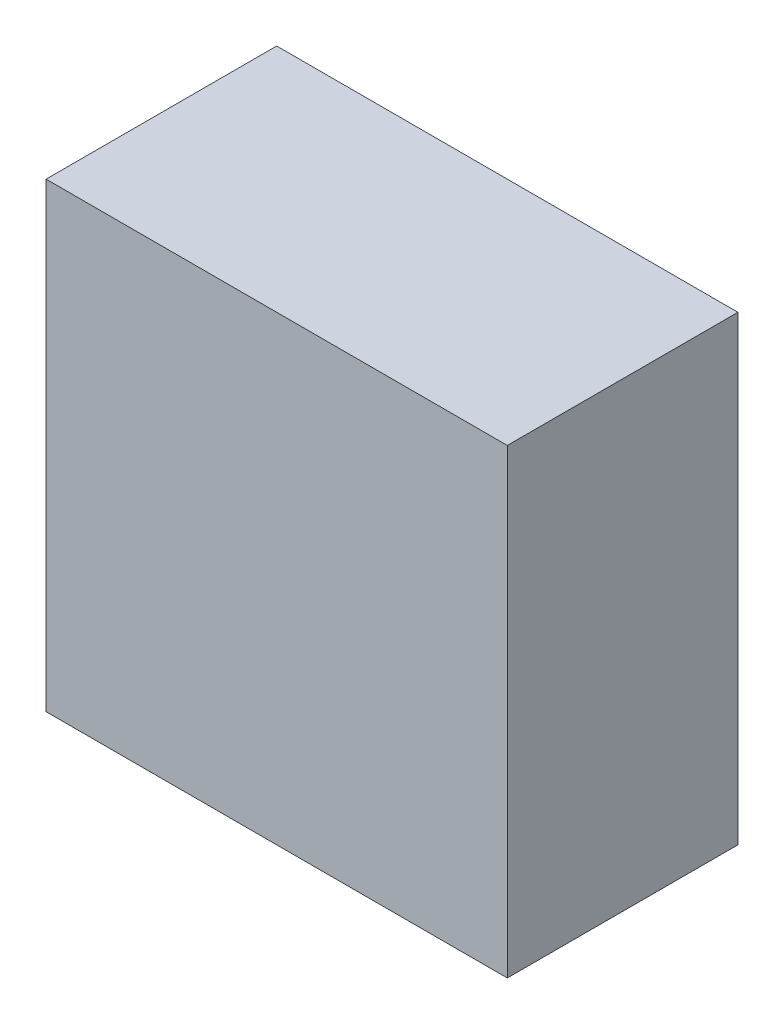
ISO-10303-21;
HEADER;
FILE_DESCRIPTION(('STEP AP214'),'2;1');
FILE_NAME('part.step','',(''),(''),'','','');
FILE_SCHEMA(('AUTOMOTIVE_DESIGN { 1 0 10303 214 1 1 1 1 }'));
ENDSEC;
DATA;
#1=APPLICATION_CONTEXT('core data for automotive mechanical design processes');
#2=APPLICATION_PROTOCOL_DEFINITION('international standard','automotive_design',2000,#1);
#3=PRODUCT_CONTEXT('',#1,'mechanical');
#4=PRODUCT('Part','Part','',(#3));
#5=PRODUCT_RELATED_PRODUCT_CATEGORY('part','',(#4));
#6=PRODUCT_DEFINITION_FORMATION('','',#4);
#7=PRODUCT_DEFINITION_CONTEXT('part definition',#1,'design');
#8=PRODUCT_DEFINITION('design','',#6,#7);
#9=PRODUCT_DEFINITION_SHAPE('','',#8);
#10=(LENGTH_UNIT() NAMED_UNIT(*) SI_UNIT(.MILLI.,.METRE.));
#11=(NAMED_UNIT(*) PLANE_ANGLE_UNIT() SI_UNIT($,.RADIAN.));
#12=(NAMED_UNIT(*) SI_UNIT($,.STERADIAN.) SOLID_ANGLE_UNIT());
#13=UNCERTAINTY_MEASURE_WITH_UNIT(LENGTH_MEASURE(1.E-05),#10,'distance_accuracy_value','');
#14=(GEOMETRIC_REPRESENTATION_CONTEXT(3) GLOBAL_UNCERTAINTY_ASSIGNED_CONTEXT((#13)) GLOBAL_UNIT_ASSIGNED_CONTEXT((#10,
#11,#12)) REPRESENTATION_CONTEXT('',''));
#15=CARTESIAN_POINT('',(0.,0.,0.));
#16=DIRECTION('',(0.,0.,1.));
#17=DIRECTION('',(1.,0.,0.));
#18=AXIS2_PLACEMENT_3D('',#15,#16,#17);
#19=CARTESIAN_POINT('',(0.,0.,-10.));
#20=DIRECTION('',(-1.,0.,0.));
#21=DIRECTION('',(0.,0.,1.));
#22=AXIS2_PLACEMENT_3D('',#19,#20,#21);
#23=PLANE('',#22);
#24=DIRECTION('',(0.,0.,-1.));
#25=VECTOR('',#24,1.);
#26=CARTESIAN_POINT('',(0.,10.,5.));
#27=LINE('',#26,#25);
#28=CARTESIAN_POINT('',(0.,10.,5.));
#29=VERTEX_POINT('',#28);
#30=CARTESIAN_POINT('',(0.,10.,0.));
#31=VERTEX_POINT('',#30);
#32=EDGE_CURVE('E115',#29,#31,#27,.T.);
#33=ORIENTED_EDGE('',*,*,#32,.F.);
#34=DIRECTION('',(0.,-1.,0.));
#35=VECTOR('',#34,1.);
#36=CARTESIAN_POINT('',(0.,0.,5.));
#37=LINE('',#36,#35);
#38=CARTESIAN_POINT('',(0.,0.,5.));
#39=VERTEX_POINT('',#38);
#40=EDGE_CURVE('E105',#29,#39,#37,.T.);
#41=ORIENTED_EDGE('',*,*,#40,.T.);
#42=DIRECTION('',(0.,0.,1.));
#43=VECTOR('',#42,1.);
#44=CARTESIAN_POINT('',(0.,0.,-10.));
#45=LINE('',#44,#43);
#46=CARTESIAN_POINT('',(0.,0.,10.));
#47=VERTEX_POINT('',#46);
#48=EDGE_CURVE('E112',#39,#47,#45,.T.);
#49=ORIENTED_EDGE('',*,*,#48,.T.);
#50=DIRECTION('',(0.,-1.,0.));
#51=VECTOR('',#50,1.);
#52=CARTESIAN_POINT('',(0.,0.,10.));
#53=LINE('',#52,#51);
#54=CARTESIAN_POINT('',(0.,40.,10.));
#55=VERTEX_POINT('',#54);
#56=EDGE_CURVE('E146',#55,#47,#53,.T.);
#57=ORIENTED_EDGE('',*,*,#56,.F.);
#58=DIRECTION('',(0.,0.,1.));
#59=VECTOR('',#58,1.);
#60=CARTESIAN_POINT('',(0.,40.,-10.));
#61=LINE('',#60,#59);
#62=CARTESIAN_POINT('',(0.,40.,-10.));
#63=VERTEX_POINT('',#62);
#64=EDGE_CURVE('E11',#63,#55,#61,.T.);
#65=ORIENTED_EDGE('',*,*,#64,.F.);
#66=DIRECTION('',(0.,-1.,0.));
#67=VECTOR('',#66,1.);
#68=CARTESIAN_POINT('',(0.,0.,-10.));
#69=LINE('',#68,#67);
#70=CARTESIAN_POINT('',(0.,0.,-10.));
#71=VERTEX_POINT('',#70);
#72=EDGE_CURVE('E151',#63,#71,#69,.T.);
#73=ORIENTED_EDGE('',*,*,#72,.T.);
#74=CARTESIAN_POINT('',(0.,0.,0.));
#75=VERTEX_POINT('',#74);
#76=EDGE_CURVE('E38',#71,#75,#45,.T.);
#77=ORIENTED_EDGE('',*,*,#76,.T.);
#78=DIRECTION('',(0.,-1.,0.));
#79=VECTOR('',#78,1.);
#80=CARTESIAN_POINT('',(0.,0.,0.));
#81=LINE('',#80,#79);
#82=EDGE_CURVE('E51',#31,#75,#81,.T.);
#83=ORIENTED_EDGE('',*,*,#82,.F.);
#84=EDGE_LOOP('',(#33,#41,#49,#57,#65,#73,#77,#83));
#85=FACE_BOUND('',#84,.T.);
#86=ADVANCED_FACE('F35',(#85),#23,.T.);
#87=CARTESIAN_POINT('',(0.,0.,-10.));
#88=DIRECTION('',(0.,-1.,0.));
#89=DIRECTION('',(0.,0.,-1.));
#90=AXIS2_PLACEMENT_3D('',#87,#88,#89);
#91=PLANE('',#90);
#92=ORIENTED_EDGE('',*,*,#48,.F.);
#93=DIRECTION('',(1.,0.,0.));
#94=VECTOR('',#93,1.);
#95=CARTESIAN_POINT('',(0.,0.,5.));
#96=LINE('',#95,#94);
#97=CARTESIAN_POINT('',(10.,0.,5.));
#98=VERTEX_POINT('',#97);
#99=EDGE_CURVE('E101',#39,#98,#96,.T.);
#100=ORIENTED_EDGE('',*,*,#99,.T.);
#101=DIRECTION('',(0.,0.,-1.));
#102=VECTOR('',#101,1.);
#103=CARTESIAN_POINT('',(10.,0.,5.));
#104=LINE('',#103,#102);
#105=CARTESIAN_POINT('',(10.,0.,0.));
#106=VERTEX_POINT('',#105);
#107=EDGE_CURVE('E177',#98,#106,#104,.T.);
#108=ORIENTED_EDGE('',*,*,#107,.T.);
#109=DIRECTION('',(1.,0.,0.));
#110=VECTOR('',#109,1.);
#111=CARTESIAN_POINT('',(0.,0.,0.));
#112=LINE('',#111,#110);
#113=EDGE_CURVE('E188',#75,#106,#112,.T.);
#114=ORIENTED_EDGE('',*,*,#113,.F.);
#115=ORIENTED_EDGE('',*,*,#76,.F.);
#116=DIRECTION('',(1.,0.,0.));
#117=VECTOR('',#116,1.);
#118=CARTESIAN_POINT('',(0.,0.,-10.));
#119=LINE('',#118,#117);
#120=CARTESIAN_POINT('',(40.,0.,-10.));
#121=VERTEX_POINT('',#120);
#122=EDGE_CURVE('E131',#71,#121,#119,.T.);
#123=ORIENTED_EDGE('',*,*,#122,.T.);
#124=DIRECTION('',(0.,0.,1.));
#125=VECTOR('',#124,1.);
#126=CARTESIAN_POINT('',(40.,0.,-10.));
#127=LINE('',#126,#125);
#128=CARTESIAN_POINT('',(40.,0.,10.));
#129=VERTEX_POINT('',#128);
#130=EDGE_CURVE('E124',#121,#129,#127,.T.);
#131=ORIENTED_EDGE('',*,*,#130,.T.);
#132=DIRECTION('',(1.,0.,0.));
#133=VECTOR('',#132,1.);
#134=CARTESIAN_POINT('',(0.,0.,10.));
#135=LINE('',#134,#133);
#136=EDGE_CURVE('E120',#47,#129,#135,.T.);
#137=ORIENTED_EDGE('',*,*,#136,.F.);
#138=EDGE_LOOP('',(#92,#100,#108,#114,#115,#123,#131,#137));
#139=FACE_BOUND('',#138,.T.);
#140=ADVANCED_FACE('F118',(#139),#91,.T.);
#141=CARTESIAN_POINT('',(0.,40.,-10.));
#142=DIRECTION('',(0.,1.,0.));
#143=DIRECTION('',(0.,0.,1.));
#144=AXIS2_PLACEMENT_3D('',#141,#142,#143);
#145=PLANE('',#144);
#146=ORIENTED_EDGE('',*,*,#64,.T.);
#147=DIRECTION('',(-1.,0.,0.));
#148=VECTOR('',#147,1.);
#149=CARTESIAN_POINT('',(0.,40.,10.));
#150=LINE('',#149,#148);
#151=CARTESIAN_POINT('',(40.,40.,10.));
#152=VERTEX_POINT('',#151);
#153=EDGE_CURVE('E149',#152,#55,#150,.T.);
#154=ORIENTED_EDGE('',*,*,#153,.F.);
#155=DIRECTION('',(0.,0.,1.));
#156=VECTOR('',#155,1.);
#157=CARTESIAN_POINT('',(40.,40.,-10.));
#158=LINE('',#157,#156);
#159=CARTESIAN_POINT('',(40.,40.,-10.));
#160=VERTEX_POINT('',#159);
#161=EDGE_CURVE('E43',#160,#152,#158,.T.);
#162=ORIENTED_EDGE('',*,*,#161,.F.);
#163=DIRECTION('',(-1.,0.,0.));
#164=VECTOR('',#163,1.);
#165=CARTESIAN_POINT('',(0.,40.,-10.));
#166=LINE('',#165,#164);
#167=EDGE_CURVE('E122',#160,#63,#166,.T.);
#168=ORIENTED_EDGE('',*,*,#167,.T.);
#169=EDGE_LOOP('',(#146,#154,#162,#168));
#170=FACE_BOUND('',#169,.T.);
#171=ADVANCED_FACE('F165',(#170),#145,.T.);
#172=CARTESIAN_POINT('',(40.,0.,-10.));
#173=DIRECTION('',(1.,0.,0.));
#174=DIRECTION('',(0.,0.,-1.));
#175=AXIS2_PLACEMENT_3D('',#172,#173,#174);
#176=PLANE('',#175);
#177=ORIENTED_EDGE('',*,*,#161,.T.);
#178=DIRECTION('',(0.,1.,0.));
#179=VECTOR('',#178,1.);
#180=CARTESIAN_POINT('',(40.,0.,10.));
#181=LINE('',#180,#179);
#182=EDGE_CURVE('E144',#129,#152,#181,.T.);
#183=ORIENTED_EDGE('',*,*,#182,.F.);
#184=ORIENTED_EDGE('',*,*,#130,.F.);
#185=DIRECTION('',(0.,1.,0.));
#186=VECTOR('',#185,1.);
#187=CARTESIAN_POINT('',(40.,0.,-10.));
#188=LINE('',#187,#186);
#189=EDGE_CURVE('E126',#121,#160,#188,.T.);
#190=ORIENTED_EDGE('',*,*,#189,.T.);
#191=EDGE_LOOP('',(#177,#183,#184,#190));
#192=FACE_BOUND('',#191,.T.);
#193=ADVANCED_FACE('F148',(#192),#176,.T.);
#194=CARTESIAN_POINT('',(0.,0.,-10.));
#195=DIRECTION('',(0.,0.,-1.));
#196=DIRECTION('',(-1.,0.,0.));
#197=AXIS2_PLACEMENT_3D('',#194,#195,#196);
#198=PLANE('',#197);
#199=ORIENTED_EDGE('',*,*,#72,.F.);
#200=ORIENTED_EDGE('',*,*,#167,.F.);
#201=ORIENTED_EDGE('',*,*,#189,.F.);
#202=ORIENTED_EDGE('',*,*,#122,.F.);
#203=EDGE_LOOP('',(#199,#200,#201,#202));
#204=FACE_BOUND('',#203,.T.);
#205=ADVANCED_FACE('F156',(#204),#198,.T.);
#206=CARTESIAN_POINT('',(0.,0.,10.));
#207=DIRECTION('',(0.,0.,-1.));
#208=DIRECTION('',(-1.,0.,0.));
#209=AXIS2_PLACEMENT_3D('',#206,#207,#208);
#210=PLANE('',#209);
#211=ORIENTED_EDGE('',*,*,#56,.T.);
#212=ORIENTED_EDGE('',*,*,#136,.T.);
#213=ORIENTED_EDGE('',*,*,#182,.T.);
#214=ORIENTED_EDGE('',*,*,#153,.T.);
#215=EDGE_LOOP('',(#211,#212,#213,#214));
#216=FACE_BOUND('',#215,.T.);
#217=ADVANCED_FACE('F142',(#216),#210,.F.);
#218=CARTESIAN_POINT('',(10.,0.,5.));
#219=DIRECTION('',(-1.,0.,0.));
#220=DIRECTION('',(0.,0.,1.));
#221=AXIS2_PLACEMENT_3D('',#218,#219,#220);
#222=PLANE('',#221);
#223=DIRECTION('',(0.,1.,0.));
#224=VECTOR('',#223,1.);
#225=CARTESIAN_POINT('',(10.,0.,0.));
#226=LINE('',#225,#224);
#227=CARTESIAN_POINT('',(10.,10.,0.));
#228=VERTEX_POINT('',#227);
#229=EDGE_CURVE('E186',#106,#228,#226,.T.);
#230=ORIENTED_EDGE('',*,*,#229,.F.);
#231=ORIENTED_EDGE('',*,*,#107,.F.);
#232=DIRECTION('',(0.,1.,0.));
#233=VECTOR('',#232,1.);
#234=CARTESIAN_POINT('',(10.,0.,5.));
#235=LINE('',#234,#233);
#236=CARTESIAN_POINT('',(10.,10.,5.));
#237=VERTEX_POINT('',#236);
#238=EDGE_CURVE('E107',#98,#237,#235,.T.);
#239=ORIENTED_EDGE('',*,*,#238,.T.);
#240=DIRECTION('',(0.,0.,-1.));
#241=VECTOR('',#240,1.);
#242=CARTESIAN_POINT('',(10.,10.,5.));
#243=LINE('',#242,#241);
#244=EDGE_CURVE('E178',#237,#228,#243,.T.);
#245=ORIENTED_EDGE('',*,*,#244,.T.);
#246=EDGE_LOOP('',(#230,#231,#239,#245));
#247=FACE_BOUND('',#246,.T.);
#248=ADVANCED_FACE('F163',(#247),#222,.T.);
#249=CARTESIAN_POINT('',(0.,10.,5.));
#250=DIRECTION('',(0.,-1.,0.));
#251=DIRECTION('',(0.,0.,-1.));
#252=AXIS2_PLACEMENT_3D('',#249,#250,#251);
#253=PLANE('',#252);
#254=DIRECTION('',(-1.,0.,0.));
#255=VECTOR('',#254,1.);
#256=CARTESIAN_POINT('',(0.,10.,0.));
#257=LINE('',#256,#255);
#258=EDGE_CURVE('E116',#228,#31,#257,.T.);
#259=ORIENTED_EDGE('',*,*,#258,.F.);
#260=ORIENTED_EDGE('',*,*,#244,.F.);
#261=DIRECTION('',(-1.,0.,0.));
#262=VECTOR('',#261,1.);
#263=CARTESIAN_POINT('',(0.,10.,5.));
#264=LINE('',#263,#262);
#265=EDGE_CURVE('E184',#237,#29,#264,.T.);
#266=ORIENTED_EDGE('',*,*,#265,.T.);
#267=ORIENTED_EDGE('',*,*,#32,.T.);
#268=EDGE_LOOP('',(#259,#260,#266,#267));
#269=FACE_BOUND('',#268,.T.);
#270=ADVANCED_FACE('F197',(#269),#253,.T.);
#271=CARTESIAN_POINT('',(0.,0.,5.));
#272=DIRECTION('',(0.,0.,-1.));
#273=DIRECTION('',(-1.,0.,0.));
#274=AXIS2_PLACEMENT_3D('',#271,#272,#273);
#275=PLANE('',#274);
#276=ORIENTED_EDGE('',*,*,#40,.F.);
#277=ORIENTED_EDGE('',*,*,#265,.F.);
#278=ORIENTED_EDGE('',*,*,#238,.F.);
#279=ORIENTED_EDGE('',*,*,#99,.F.);
#280=EDGE_LOOP('',(#276,#277,#278,#279));
#281=FACE_BOUND('',#280,.T.);
#282=ADVANCED_FACE('F103',(#281),#275,.T.);
#283=CARTESIAN_POINT('',(0.,0.,0.));
#284=DIRECTION('',(0.,0.,-1.));
#285=DIRECTION('',(-1.,0.,0.));
#286=AXIS2_PLACEMENT_3D('',#283,#284,#285);
#287=PLANE('',#286);
#288=ORIENTED_EDGE('',*,*,#82,.T.);
#289=ORIENTED_EDGE('',*,*,#113,.T.);
#290=ORIENTED_EDGE('',*,*,#229,.T.);
#291=ORIENTED_EDGE('',*,*,#258,.T.);
#292=EDGE_LOOP('',(#288,#289,#290,#291));
#293=FACE_BOUND('',#292,.T.);
#294=ADVANCED_FACE('F198',(#293),#287,.F.);
#295=CLOSED_SHELL('',(#86,#140,#171,#193,#205,#217,#248,#270,#282,#294));
#296=MANIFOLD_SOLID_BREP('B2',#295);
#297=ADVANCED_BREP_SHAPE_REPRESENTATION('',(#18,#296),#14);
#298=SHAPE_DEFINITION_REPRESENTATION(#9,#297);
ENDSEC;
END-ISO-10303-21;
